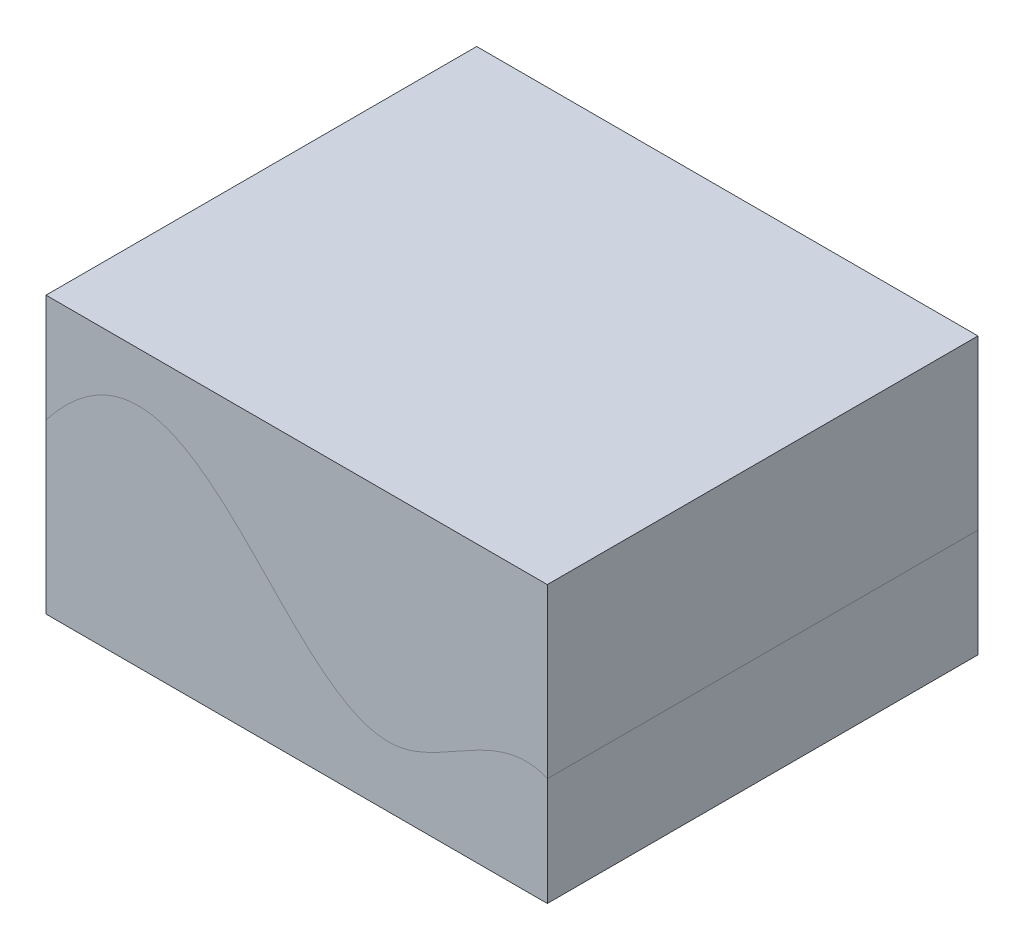
ISO-10303-21;
HEADER;
FILE_DESCRIPTION(('STEP AP214'),'2;1');
FILE_NAME('part.step','',(''),(''),'','','');
FILE_SCHEMA(('AUTOMOTIVE_DESIGN { 1 0 10303 214 1 1 1 1 }'));
ENDSEC;
DATA;
#1=APPLICATION_CONTEXT('core data for automotive mechanical design processes');
#2=APPLICATION_PROTOCOL_DEFINITION('international standard','automotive_design',2000,#1);
#3=PRODUCT_CONTEXT('',#1,'mechanical');
#4=PRODUCT('Part','Part','',(#3));
#5=PRODUCT_RELATED_PRODUCT_CATEGORY('part','',(#4));
#6=PRODUCT_DEFINITION_FORMATION('','',#4);
#7=PRODUCT_DEFINITION_CONTEXT('part definition',#1,'design');
#8=PRODUCT_DEFINITION('design','',#6,#7);
#9=PRODUCT_DEFINITION_SHAPE('','',#8);
#10=(LENGTH_UNIT() NAMED_UNIT(*) SI_UNIT(.MILLI.,.METRE.));
#11=(NAMED_UNIT(*) PLANE_ANGLE_UNIT() SI_UNIT($,.RADIAN.));
#12=(NAMED_UNIT(*) SI_UNIT($,.STERADIAN.) SOLID_ANGLE_UNIT());
#13=UNCERTAINTY_MEASURE_WITH_UNIT(LENGTH_MEASURE(1.E-05),#10,'distance_accuracy_value','');
#14=(GEOMETRIC_REPRESENTATION_CONTEXT(3) GLOBAL_UNCERTAINTY_ASSIGNED_CONTEXT((#13)) GLOBAL_UNIT_ASSIGNED_CONTEXT((#10,
#11,#12)) REPRESENTATION_CONTEXT('',''));
#15=CARTESIAN_POINT('',(0.,0.,0.));
#16=DIRECTION('',(0.,0.,1.));
#17=DIRECTION('',(1.,0.,0.));
#18=AXIS2_PLACEMENT_3D('',#15,#16,#17);
#19=CARTESIAN_POINT('',(-88.9503624856376,22.5454685632026,62.6633162704457));
#20=CARTESIAN_POINT('',(-37.8141386567155,125.215292475116,62.6633162704457));
#21=CARTESIAN_POINT('',(5.84947542840994,-43.7179988687432,62.6633162704457));
#22=CARTESIAN_POINT('',(69.6437169043807,52.4820397279148,62.6633162704457));
#23=CARTESIAN_POINT('',(87.5841174456941,13.9727510125804,62.6633162704457));
#24=B_SPLINE_CURVE_WITH_KNOTS('',3,(#19,#20,#21,#22,#23),.UNSPECIFIED.,.F.,.F.,(4,1,4),(0.,
0.6650166527823,1.),.UNSPECIFIED.);
#25=DIRECTION('',(0.,0.,1.));
#26=VECTOR('',#25,1.);
#27=SURFACE_OF_LINEAR_EXTRUSION('',#24,#26);
#28=CARTESIAN_POINT('',(-88.9503624856376,22.5454685632026,-62.6633162704457));
#29=CARTESIAN_POINT('',(-37.8141386567155,125.215292475116,-62.6633162704457));
#30=CARTESIAN_POINT('',(5.84947542840994,-43.7179988687432,-62.6633162704457));
#31=CARTESIAN_POINT('',(69.6437169043807,52.4820397279148,-62.6633162704457));
#32=CARTESIAN_POINT('',(87.5841174456941,13.9727510125804,-62.6633162704457));
#33=B_SPLINE_CURVE_WITH_KNOTS('',3,(#28,#29,#30,#31,#32),.UNSPECIFIED.,.F.,.F.,(4,1,4),(0.,
0.6650166527823,1.),.UNSPECIFIED.);
#34=CARTESIAN_POINT('',(-72.9401001387988,48.9314370628439,-62.6633162704457));
#35=VERTEX_POINT('',#34);
#36=CARTESIAN_POINT('',(72.9401001387988,31.4552387571009,-62.6633162704457));
#37=VERTEX_POINT('',#36);
#38=EDGE_CURVE('E110',#35,#37,#33,.T.);
#39=ORIENTED_EDGE('',*,*,#38,.T.);
#40=DIRECTION('',(0.,0.,1.));
#41=VECTOR('',#40,1.);
#42=CARTESIAN_POINT('',(72.9401001387998,31.4552387573265,62.6633162704457));
#43=LINE('',#42,#41);
#44=CARTESIAN_POINT('',(72.9401001387988,31.4552387571009,62.6633162704457));
#45=VERTEX_POINT('',#44);
#46=EDGE_CURVE('E97',#37,#45,#43,.T.);
#47=ORIENTED_EDGE('',*,*,#46,.T.);
#48=CARTESIAN_POINT('',(-88.9503624856376,22.5454685632026,62.6633162704457));
#49=CARTESIAN_POINT('',(-37.8141386567155,125.215292475116,62.6633162704457));
#50=CARTESIAN_POINT('',(5.84947542840994,-43.7179988687432,62.6633162704457));
#51=CARTESIAN_POINT('',(69.6437169043807,52.4820397279148,62.6633162704457));
#52=CARTESIAN_POINT('',(87.5841174456941,13.9727510125804,62.6633162704457));
#53=B_SPLINE_CURVE_WITH_KNOTS('',3,(#48,#49,#50,#51,#52),.UNSPECIFIED.,.F.,.F.,(4,1,4),(0.,
0.6650166527823,1.),.UNSPECIFIED.);
#54=CARTESIAN_POINT('',(-72.9401001387988,48.9314370687057,62.6633162704457));
#55=VERTEX_POINT('',#54);
#56=EDGE_CURVE('E108',#45,#55,#53,.F.);
#57=ORIENTED_EDGE('',*,*,#56,.T.);
#58=DIRECTION('',(0.,0.,1.));
#59=VECTOR('',#58,1.);
#60=CARTESIAN_POINT('',(-72.9401001387988,48.9314370628439,62.6633162704457));
#61=LINE('',#60,#59);
#62=EDGE_CURVE('E116',#55,#35,#61,.F.);
#63=ORIENTED_EDGE('',*,*,#62,.T.);
#64=EDGE_LOOP('',(#39,#47,#57,#63));
#65=FACE_BOUND('',#64,.T.);
#66=ADVANCED_FACE('F53',(#65),#27,.T.);
#67=CARTESIAN_POINT('',(72.9401001387988,80.3747042919709,62.6633162704457));
#68=DIRECTION('',(-1.,0.,0.));
#69=DIRECTION('',(0.,0.,1.));
#70=AXIS2_PLACEMENT_3D('',#67,#68,#69);
#71=PLANE('',#70);
#72=ORIENTED_EDGE('',*,*,#46,.F.);
#73=DIRECTION('',(0.,-1.,0.));
#74=VECTOR('',#73,1.);
#75=CARTESIAN_POINT('',(72.9401001387988,80.3747042919709,-62.6633162704457));
#76=LINE('',#75,#74);
#77=CARTESIAN_POINT('',(72.9401001387988,80.3747042919709,-62.6633162704457));
#78=VERTEX_POINT('',#77);
#79=EDGE_CURVE('E111',#78,#37,#76,.T.);
#80=ORIENTED_EDGE('',*,*,#79,.F.);
#81=DIRECTION('',(0.,0.,-1.));
#82=VECTOR('',#81,1.);
#83=CARTESIAN_POINT('',(72.9401001387988,80.3747042919709,62.6633162704457));
#84=LINE('',#83,#82);
#85=CARTESIAN_POINT('',(72.9401001387988,80.3747042919709,62.6633162704457));
#86=VERTEX_POINT('',#85);
#87=EDGE_CURVE('E12',#86,#78,#84,.T.);
#88=ORIENTED_EDGE('',*,*,#87,.F.);
#89=DIRECTION('',(0.,-1.,0.));
#90=VECTOR('',#89,1.);
#91=CARTESIAN_POINT('',(72.9401001387988,80.3747042919709,62.6633162704457));
#92=LINE('',#91,#90);
#93=EDGE_CURVE('E93',#86,#45,#92,.T.);
#94=ORIENTED_EDGE('',*,*,#93,.T.);
#95=EDGE_LOOP('',(#72,#80,#88,#94));
#96=FACE_BOUND('',#95,.T.);
#97=ADVANCED_FACE('F95',(#96),#71,.F.);
#98=CARTESIAN_POINT('',(-72.9401001387988,80.3747042919709,-62.6633162704457));
#99=DIRECTION('',(0.,0.,1.));
#100=DIRECTION('',(1.,0.,0.));
#101=AXIS2_PLACEMENT_3D('',#98,#99,#100);
#102=PLANE('',#101);
#103=ORIENTED_EDGE('',*,*,#38,.F.);
#104=DIRECTION('',(0.,-1.,0.));
#105=VECTOR('',#104,1.);
#106=CARTESIAN_POINT('',(-72.9401001387988,80.3747042919709,-62.6633162704457));
#107=LINE('',#106,#105);
#108=CARTESIAN_POINT('',(-72.9401001387988,80.3747042919709,-62.6633162704457));
#109=VERTEX_POINT('',#108);
#110=EDGE_CURVE('E131',#109,#35,#107,.T.);
#111=ORIENTED_EDGE('',*,*,#110,.F.);
#112=DIRECTION('',(-1.,0.,0.));
#113=VECTOR('',#112,1.);
#114=CARTESIAN_POINT('',(-72.9401001387988,80.3747042919709,-62.6633162704457));
#115=LINE('',#114,#113);
#116=EDGE_CURVE('E63',#78,#109,#115,.T.);
#117=ORIENTED_EDGE('',*,*,#116,.F.);
#118=ORIENTED_EDGE('',*,*,#79,.T.);
#119=EDGE_LOOP('',(#103,#111,#117,#118));
#120=FACE_BOUND('',#119,.T.);
#121=ADVANCED_FACE('F141',(#120),#102,.F.);
#122=CARTESIAN_POINT('',(-72.9401001387988,80.3747042919709,62.6633162704457));
#123=DIRECTION('',(1.,0.,0.));
#124=DIRECTION('',(0.,0.,-1.));
#125=AXIS2_PLACEMENT_3D('',#122,#123,#124);
#126=PLANE('',#125);
#127=ORIENTED_EDGE('',*,*,#62,.F.);
#128=DIRECTION('',(0.,-1.,0.));
#129=VECTOR('',#128,1.);
#130=CARTESIAN_POINT('',(-72.9401001387988,80.3747042919709,62.6633162704457));
#131=LINE('',#130,#129);
#132=CARTESIAN_POINT('',(-72.9401001387988,80.3747042919709,62.6633162704457));
#133=VERTEX_POINT('',#132);
#134=EDGE_CURVE('E103',#133,#55,#131,.T.);
#135=ORIENTED_EDGE('',*,*,#134,.F.);
#136=DIRECTION('',(0.,0.,1.));
#137=VECTOR('',#136,1.);
#138=CARTESIAN_POINT('',(-72.9401001387988,80.3747042919709,62.6633162704457));
#139=LINE('',#138,#137);
#140=EDGE_CURVE('E135',#109,#133,#139,.T.);
#141=ORIENTED_EDGE('',*,*,#140,.F.);
#142=ORIENTED_EDGE('',*,*,#110,.T.);
#143=EDGE_LOOP('',(#127,#135,#141,#142));
#144=FACE_BOUND('',#143,.T.);
#145=ADVANCED_FACE('F140',(#144),#126,.F.);
#146=CARTESIAN_POINT('',(-72.9401001387988,80.3747042919709,62.6633162704457));
#147=DIRECTION('',(0.,0.,-1.));
#148=DIRECTION('',(-1.,0.,0.));
#149=AXIS2_PLACEMENT_3D('',#146,#147,#148);
#150=PLANE('',#149);
#151=ORIENTED_EDGE('',*,*,#56,.F.);
#152=ORIENTED_EDGE('',*,*,#93,.F.);
#153=DIRECTION('',(1.,0.,0.));
#154=VECTOR('',#153,1.);
#155=CARTESIAN_POINT('',(-72.9401001387988,80.3747042919709,62.6633162704457));
#156=LINE('',#155,#154);
#157=EDGE_CURVE('E102',#133,#86,#156,.T.);
#158=ORIENTED_EDGE('',*,*,#157,.F.);
#159=ORIENTED_EDGE('',*,*,#134,.T.);
#160=EDGE_LOOP('',(#151,#152,#158,#159));
#161=FACE_BOUND('',#160,.T.);
#162=ADVANCED_FACE('F113',(#161),#150,.F.);
#163=CARTESIAN_POINT('',(0.,80.3747042919709,0.));
#164=DIRECTION('',(0.,-1.,0.));
#165=DIRECTION('',(0.,0.,-1.));
#166=AXIS2_PLACEMENT_3D('',#163,#164,#165);
#167=PLANE('',#166);
#168=ORIENTED_EDGE('',*,*,#87,.T.);
#169=ORIENTED_EDGE('',*,*,#116,.T.);
#170=ORIENTED_EDGE('',*,*,#140,.T.);
#171=ORIENTED_EDGE('',*,*,#157,.T.);
#172=EDGE_LOOP('',(#168,#169,#170,#171));
#173=FACE_BOUND('',#172,.T.);
#174=ADVANCED_FACE('F137',(#173),#167,.F.);
#175=CLOSED_SHELL('',(#66,#97,#121,#145,#162,#174));
#176=MANIFOLD_SOLID_BREP('B2_NOT_SHOWN',#175);
#177=CARTESIAN_POINT('',(-88.9503624856376,22.5454685632026,62.6633162704457));
#178=CARTESIAN_POINT('',(-37.8141386567155,125.215292475116,62.6633162704457));
#179=CARTESIAN_POINT('',(5.84947542840994,-43.7179988687432,62.6633162704457));
#180=CARTESIAN_POINT('',(69.6437169043807,52.4820397279148,62.6633162704457));
#181=CARTESIAN_POINT('',(87.5841174456941,13.9727510125804,62.6633162704457));
#182=B_SPLINE_CURVE_WITH_KNOTS('',3,(#177,#178,#179,#180,#181),.UNSPECIFIED.,.F.,.F.,(4,1,4),
(0.,0.6650166527823,1.),.UNSPECIFIED.);
#183=DIRECTION('',(0.,0.,1.));
#184=VECTOR('',#183,1.);
#185=SURFACE_OF_LINEAR_EXTRUSION('',#182,#184);
#186=CARTESIAN_POINT('',(-88.9503624856376,22.5454685632026,-62.6633162704457));
#187=CARTESIAN_POINT('',(-37.8141386567155,125.215292475116,-62.6633162704457));
#188=CARTESIAN_POINT('',(5.84947542840994,-43.7179988687432,-62.6633162704457));
#189=CARTESIAN_POINT('',(69.6437169043807,52.4820397279148,-62.6633162704457));
#190=CARTESIAN_POINT('',(87.5841174456941,13.9727510125804,-62.6633162704457));
#191=B_SPLINE_CURVE_WITH_KNOTS('',3,(#186,#187,#188,#189,#190),.UNSPECIFIED.,.F.,.F.,(4,1,4),
(0.,0.6650166527823,1.),.UNSPECIFIED.);
#192=CARTESIAN_POINT('',(-72.9401001387988,48.9314370628439,-62.6633162704457));
#193=VERTEX_POINT('',#192);
#194=CARTESIAN_POINT('',(72.9401001387988,31.4552387571009,-62.6633162704457));
#195=VERTEX_POINT('',#194);
#196=EDGE_CURVE('E212',#193,#195,#191,.T.);
#197=ORIENTED_EDGE('',*,*,#196,.F.);
#198=DIRECTION('',(0.,0.,1.));
#199=VECTOR('',#198,1.);
#200=CARTESIAN_POINT('',(-72.9401001387988,48.9314370628439,62.6633162704457));
#201=LINE('',#200,#199);
#202=CARTESIAN_POINT('',(-72.9401001387988,48.9314370687057,62.6633162704457));
#203=VERTEX_POINT('',#202);
#204=EDGE_CURVE('E275',#203,#193,#201,.F.);
#205=ORIENTED_EDGE('',*,*,#204,.F.);
#206=CARTESIAN_POINT('',(-88.9503624856376,22.5454685632026,62.6633162704457));
#207=CARTESIAN_POINT('',(-37.8141386567155,125.215292475116,62.6633162704457));
#208=CARTESIAN_POINT('',(5.84947542840994,-43.7179988687432,62.6633162704457));
#209=CARTESIAN_POINT('',(69.6437169043807,52.4820397279148,62.6633162704457));
#210=CARTESIAN_POINT('',(87.5841174456941,13.9727510125804,62.6633162704457));
#211=B_SPLINE_CURVE_WITH_KNOTS('',3,(#206,#207,#208,#209,#210),.UNSPECIFIED.,.F.,.F.,(4,1,4),
(0.,0.6650166527823,1.),.UNSPECIFIED.);
#212=CARTESIAN_POINT('',(72.9401001387988,31.4552387571009,62.6633162704457));
#213=VERTEX_POINT('',#212);
#214=EDGE_CURVE('E224',#213,#203,#211,.F.);
#215=ORIENTED_EDGE('',*,*,#214,.F.);
#216=DIRECTION('',(0.,0.,1.));
#217=VECTOR('',#216,1.);
#218=CARTESIAN_POINT('',(72.9401001387998,31.4552387573265,62.6633162704457));
#219=LINE('',#218,#217);
#220=EDGE_CURVE('E51',#195,#213,#219,.T.);
#221=ORIENTED_EDGE('',*,*,#220,.F.);
#222=EDGE_LOOP('',(#197,#205,#215,#221));
#223=FACE_BOUND('',#222,.T.);
#224=ADVANCED_FACE('F204',(#223),#185,.F.);
#225=CARTESIAN_POINT('',(-72.9401001387988,80.3747042919709,-62.6633162704457));
#226=DIRECTION('',(0.,0.,1.));
#227=DIRECTION('',(1.,0.,0.));
#228=AXIS2_PLACEMENT_3D('',#225,#226,#227);
#229=PLANE('',#228);
#230=DIRECTION('',(0.,-1.,0.));
#231=VECTOR('',#230,1.);
#232=CARTESIAN_POINT('',(-72.9401001387988,80.3747042919709,-62.6633162704457));
#233=LINE('',#232,#231);
#234=CARTESIAN_POINT('',(-72.9401001387988,0.,-62.6633162704457));
#235=VERTEX_POINT('',#234);
#236=EDGE_CURVE('E251',#193,#235,#233,.T.);
#237=ORIENTED_EDGE('',*,*,#236,.F.);
#238=ORIENTED_EDGE('',*,*,#196,.T.);
#239=DIRECTION('',(0.,-1.,0.));
#240=VECTOR('',#239,1.);
#241=CARTESIAN_POINT('',(72.9401001387988,80.3747042919709,-62.6633162704457));
#242=LINE('',#241,#240);
#243=CARTESIAN_POINT('',(72.9401001387988,0.,-62.6633162704457));
#244=VERTEX_POINT('',#243);
#245=EDGE_CURVE('E243',#195,#244,#242,.T.);
#246=ORIENTED_EDGE('',*,*,#245,.T.);
#247=DIRECTION('',(-1.,0.,0.));
#248=VECTOR('',#247,1.);
#249=CARTESIAN_POINT('',(-72.9401001387988,0.,-62.6633162704457));
#250=LINE('',#249,#248);
#251=EDGE_CURVE('E247',#244,#235,#250,.T.);
#252=ORIENTED_EDGE('',*,*,#251,.T.);
#253=EDGE_LOOP('',(#237,#238,#246,#252));
#254=FACE_BOUND('',#253,.T.);
#255=ADVANCED_FACE('F246',(#254),#229,.F.);
#256=CARTESIAN_POINT('',(0.,0.,0.));
#257=DIRECTION('',(0.,-1.,0.));
#258=DIRECTION('',(0.,0.,-1.));
#259=AXIS2_PLACEMENT_3D('',#256,#257,#258);
#260=PLANE('',#259);
#261=DIRECTION('',(0.,0.,-1.));
#262=VECTOR('',#261,1.);
#263=CARTESIAN_POINT('',(72.9401001387988,0.,62.6633162704457));
#264=LINE('',#263,#262);
#265=CARTESIAN_POINT('',(72.9401001387988,0.,62.6633162704457));
#266=VERTEX_POINT('',#265);
#267=EDGE_CURVE('E257',#266,#244,#264,.T.);
#268=ORIENTED_EDGE('',*,*,#267,.F.);
#269=DIRECTION('',(1.,0.,0.));
#270=VECTOR('',#269,1.);
#271=CARTESIAN_POINT('',(-72.9401001387988,0.,62.6633162704457));
#272=LINE('',#271,#270);
#273=CARTESIAN_POINT('',(-72.9401001387988,0.,62.6633162704457));
#274=VERTEX_POINT('',#273);
#275=EDGE_CURVE('E267',#274,#266,#272,.T.);
#276=ORIENTED_EDGE('',*,*,#275,.F.);
#277=DIRECTION('',(0.,0.,1.));
#278=VECTOR('',#277,1.);
#279=CARTESIAN_POINT('',(-72.9401001387988,0.,62.6633162704457));
#280=LINE('',#279,#278);
#281=EDGE_CURVE('E259',#235,#274,#280,.T.);
#282=ORIENTED_EDGE('',*,*,#281,.F.);
#283=ORIENTED_EDGE('',*,*,#251,.F.);
#284=EDGE_LOOP('',(#268,#276,#282,#283));
#285=FACE_BOUND('',#284,.T.);
#286=ADVANCED_FACE('F255',(#285),#260,.T.);
#287=CARTESIAN_POINT('',(-72.9401001387988,80.3747042919709,62.6633162704457));
#288=DIRECTION('',(1.,0.,0.));
#289=DIRECTION('',(0.,0.,-1.));
#290=AXIS2_PLACEMENT_3D('',#287,#288,#289);
#291=PLANE('',#290);
#292=DIRECTION('',(0.,-1.,0.));
#293=VECTOR('',#292,1.);
#294=CARTESIAN_POINT('',(-72.9401001387988,80.3747042919709,62.6633162704457));
#295=LINE('',#294,#293);
#296=EDGE_CURVE('E270',#203,#274,#295,.T.);
#297=ORIENTED_EDGE('',*,*,#296,.F.);
#298=ORIENTED_EDGE('',*,*,#204,.T.);
#299=ORIENTED_EDGE('',*,*,#236,.T.);
#300=ORIENTED_EDGE('',*,*,#281,.T.);
#301=EDGE_LOOP('',(#297,#298,#299,#300));
#302=FACE_BOUND('',#301,.T.);
#303=ADVANCED_FACE('F293',(#302),#291,.F.);
#304=CARTESIAN_POINT('',(72.9401001387988,80.3747042919709,62.6633162704457));
#305=DIRECTION('',(-1.,0.,0.));
#306=DIRECTION('',(0.,0.,1.));
#307=AXIS2_PLACEMENT_3D('',#304,#305,#306);
#308=PLANE('',#307);
#309=ORIENTED_EDGE('',*,*,#245,.F.);
#310=ORIENTED_EDGE('',*,*,#220,.T.);
#311=DIRECTION('',(0.,-1.,0.));
#312=VECTOR('',#311,1.);
#313=CARTESIAN_POINT('',(72.9401001387988,80.3747042919709,62.6633162704457));
#314=LINE('',#313,#312);
#315=EDGE_CURVE('E262',#213,#266,#314,.T.);
#316=ORIENTED_EDGE('',*,*,#315,.T.);
#317=ORIENTED_EDGE('',*,*,#267,.T.);
#318=EDGE_LOOP('',(#309,#310,#316,#317));
#319=FACE_BOUND('',#318,.T.);
#320=ADVANCED_FACE('F261',(#319),#308,.F.);
#321=CARTESIAN_POINT('',(-72.9401001387988,80.3747042919709,62.6633162704457));
#322=DIRECTION('',(0.,0.,-1.));
#323=DIRECTION('',(-1.,0.,0.));
#324=AXIS2_PLACEMENT_3D('',#321,#322,#323);
#325=PLANE('',#324);
#326=ORIENTED_EDGE('',*,*,#315,.F.);
#327=ORIENTED_EDGE('',*,*,#214,.T.);
#328=ORIENTED_EDGE('',*,*,#296,.T.);
#329=ORIENTED_EDGE('',*,*,#275,.T.);
#330=EDGE_LOOP('',(#326,#327,#328,#329));
#331=FACE_BOUND('',#330,.T.);
#332=ADVANCED_FACE('F295',(#331),#325,.F.);
#333=CLOSED_SHELL('',(#224,#255,#286,#303,#320,#332));
#334=MANIFOLD_SOLID_BREP('B6',#333);
#335=ADVANCED_BREP_SHAPE_REPRESENTATION('',(#18,#176,#334),#14);
#336=SHAPE_DEFINITION_REPRESENTATION(#9,#335);
ENDSEC;
END-ISO-10303-21;
